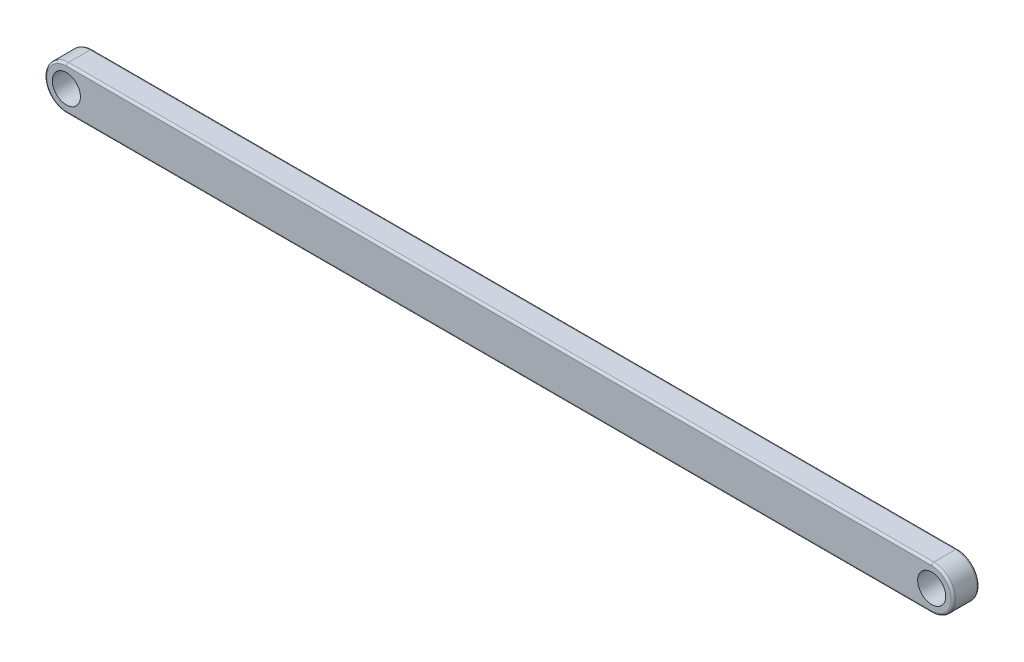
ISO-10303-21;
HEADER;
FILE_DESCRIPTION(('STEP AP214'),'2;1');
FILE_NAME('part.step','',(''),(''),'','','');
FILE_SCHEMA(('AUTOMOTIVE_DESIGN { 1 0 10303 214 1 1 1 1 }'));
ENDSEC;
DATA;
#1=APPLICATION_CONTEXT('core data for automotive mechanical design processes');
#2=APPLICATION_PROTOCOL_DEFINITION('international standard','automotive_design',2000,#1);
#3=PRODUCT_CONTEXT('',#1,'mechanical');
#4=PRODUCT('Part','Part','',(#3));
#5=PRODUCT_RELATED_PRODUCT_CATEGORY('part','',(#4));
#6=PRODUCT_DEFINITION_FORMATION('','',#4);
#7=PRODUCT_DEFINITION_CONTEXT('part definition',#1,'design');
#8=PRODUCT_DEFINITION('design','',#6,#7);
#9=PRODUCT_DEFINITION_SHAPE('','',#8);
#10=(LENGTH_UNIT() NAMED_UNIT(*) SI_UNIT(.MILLI.,.METRE.));
#11=(NAMED_UNIT(*) PLANE_ANGLE_UNIT() SI_UNIT($,.RADIAN.));
#12=(NAMED_UNIT(*) SI_UNIT($,.STERADIAN.) SOLID_ANGLE_UNIT());
#13=UNCERTAINTY_MEASURE_WITH_UNIT(LENGTH_MEASURE(1.E-05),#10,'distance_accuracy_value','');
#14=(GEOMETRIC_REPRESENTATION_CONTEXT(3) GLOBAL_UNCERTAINTY_ASSIGNED_CONTEXT((#13)) GLOBAL_UNIT_ASSIGNED_CONTEXT((#10,
#11,#12)) REPRESENTATION_CONTEXT('',''));
#15=CARTESIAN_POINT('',(0.,0.,0.));
#16=DIRECTION('',(0.,0.,1.));
#17=DIRECTION('',(1.,0.,0.));
#18=AXIS2_PLACEMENT_3D('',#15,#16,#17);
#19=CARTESIAN_POINT('',(-150.218340611354,0.,9.));
#20=DIRECTION('',(0.,0.,1.));
#21=DIRECTION('',(1.,0.,0.));
#22=AXIS2_PLACEMENT_3D('',#19,#20,#21);
#23=PLANE('',#22);
#24=DIRECTION('',(1.,0.,0.));
#25=VECTOR('',#24,1.);
#26=CARTESIAN_POINT('',(249.781659388646,-9.,9.));
#27=LINE('',#26,#25);
#28=CARTESIAN_POINT('',(-150.218340611354,-9.,9.));
#29=VERTEX_POINT('',#28);
#30=CARTESIAN_POINT('',(249.781659388646,-9.,9.));
#31=VERTEX_POINT('',#30);
#32=EDGE_CURVE('E52',#29,#31,#27,.T.);
#33=ORIENTED_EDGE('',*,*,#32,.T.);
#34=CARTESIAN_POINT('',(249.781659388646,0.,9.));
#35=DIRECTION('',(0.,0.,1.));
#36=DIRECTION('',(1.,0.,0.));
#37=AXIS2_PLACEMENT_3D('',#34,#35,#36);
#38=CIRCLE('',#37,9.);
#39=CARTESIAN_POINT('',(249.781659388646,9.,9.));
#40=VERTEX_POINT('',#39);
#41=EDGE_CURVE('E111',#31,#40,#38,.T.);
#42=ORIENTED_EDGE('',*,*,#41,.T.);
#43=DIRECTION('',(-1.,0.,0.));
#44=VECTOR('',#43,1.);
#45=CARTESIAN_POINT('',(-150.218340611354,9.,9.));
#46=LINE('',#45,#44);
#47=CARTESIAN_POINT('',(-150.218340611354,9.,9.));
#48=VERTEX_POINT('',#47);
#49=EDGE_CURVE('E135',#40,#48,#46,.T.);
#50=ORIENTED_EDGE('',*,*,#49,.T.);
#51=CARTESIAN_POINT('',(-150.218340611354,0.,9.));
#52=DIRECTION('',(0.,0.,1.));
#53=DIRECTION('',(1.,0.,0.));
#54=AXIS2_PLACEMENT_3D('',#51,#52,#53);
#55=CIRCLE('',#54,9.);
#56=EDGE_CURVE('E57',#48,#29,#55,.T.);
#57=ORIENTED_EDGE('',*,*,#56,.T.);
#58=EDGE_LOOP('',(#33,#42,#50,#57));
#59=FACE_BOUND('',#58,.T.);
#60=CARTESIAN_POINT('',(-150.218340611354,0.,9.));
#61=DIRECTION('',(0.,0.,1.));
#62=DIRECTION('',(1.,0.,0.));
#63=AXIS2_PLACEMENT_3D('',#60,#61,#62);
#64=CIRCLE('',#63,6.5);
#65=CARTESIAN_POINT('',(-143.718340611354,0.,9.));
#66=VERTEX_POINT('',#65);
#67=EDGE_CURVE('E172',#66,#66,#64,.T.);
#68=ORIENTED_EDGE('',*,*,#67,.F.);
#69=EDGE_LOOP('',(#68));
#70=FACE_BOUND('',#69,.T.);
#71=CARTESIAN_POINT('',(249.781659388646,0.,9.));
#72=DIRECTION('',(0.,0.,1.));
#73=DIRECTION('',(1.,0.,0.));
#74=AXIS2_PLACEMENT_3D('',#71,#72,#73);
#75=CIRCLE('',#74,6.50000000000002);
#76=CARTESIAN_POINT('',(256.281659388646,0.,9.));
#77=VERTEX_POINT('',#76);
#78=EDGE_CURVE('E164',#77,#77,#75,.T.);
#79=ORIENTED_EDGE('',*,*,#78,.F.);
#80=EDGE_LOOP('',(#79));
#81=FACE_BOUND('',#80,.T.);
#82=ADVANCED_FACE('F35',(#59,#70,#81),#23,.T.);
#83=CARTESIAN_POINT('',(-150.218340611354,0.,-3.));
#84=DIRECTION('',(0.,0.,1.));
#85=DIRECTION('',(1.,0.,0.));
#86=AXIS2_PLACEMENT_3D('',#83,#84,#85);
#87=PLANE('',#86);
#88=DIRECTION('',(-1.,0.,0.));
#89=VECTOR('',#88,1.);
#90=CARTESIAN_POINT('',(-150.218340611354,9.,-3.));
#91=LINE('',#90,#89);
#92=CARTESIAN_POINT('',(-150.218340611354,9.,-3.));
#93=VERTEX_POINT('',#92);
#94=CARTESIAN_POINT('',(249.781659388646,9.,-3.));
#95=VERTEX_POINT('',#94);
#96=EDGE_CURVE('E182',#93,#95,#91,.F.);
#97=ORIENTED_EDGE('',*,*,#96,.T.);
#98=CARTESIAN_POINT('',(249.781659388646,0.,-3.));
#99=DIRECTION('',(0.,0.,1.));
#100=DIRECTION('',(1.,0.,0.));
#101=AXIS2_PLACEMENT_3D('',#98,#99,#100);
#102=CIRCLE('',#101,9.);
#103=CARTESIAN_POINT('',(249.781659388646,-9.,-3.));
#104=VERTEX_POINT('',#103);
#105=EDGE_CURVE('E188',#95,#104,#102,.F.);
#106=ORIENTED_EDGE('',*,*,#105,.T.);
#107=DIRECTION('',(1.,0.,0.));
#108=VECTOR('',#107,1.);
#109=CARTESIAN_POINT('',(-150.218340611354,-9.,-3.));
#110=LINE('',#109,#108);
#111=CARTESIAN_POINT('',(-150.218340611354,-9.,-3.));
#112=VERTEX_POINT('',#111);
#113=EDGE_CURVE('E186',#104,#112,#110,.F.);
#114=ORIENTED_EDGE('',*,*,#113,.T.);
#115=CARTESIAN_POINT('',(-150.218340611354,0.,-3.));
#116=DIRECTION('',(0.,0.,1.));
#117=DIRECTION('',(1.,0.,0.));
#118=AXIS2_PLACEMENT_3D('',#115,#116,#117);
#119=CIRCLE('',#118,9.);
#120=EDGE_CURVE('E184',#112,#93,#119,.F.);
#121=ORIENTED_EDGE('',*,*,#120,.T.);
#122=EDGE_LOOP('',(#97,#106,#114,#121));
#123=FACE_BOUND('',#122,.T.);
#124=CARTESIAN_POINT('',(-150.218340611354,0.,-3.));
#125=DIRECTION('',(0.,0.,1.));
#126=DIRECTION('',(1.,0.,0.));
#127=AXIS2_PLACEMENT_3D('',#124,#125,#126);
#128=CIRCLE('',#127,6.5);
#129=CARTESIAN_POINT('',(-143.718340611354,0.,-3.));
#130=VERTEX_POINT('',#129);
#131=EDGE_CURVE('E169',#130,#130,#128,.T.);
#132=ORIENTED_EDGE('',*,*,#131,.T.);
#133=EDGE_LOOP('',(#132));
#134=FACE_BOUND('',#133,.T.);
#135=CARTESIAN_POINT('',(249.781659388646,0.,-3.));
#136=DIRECTION('',(0.,0.,1.));
#137=DIRECTION('',(1.,0.,0.));
#138=AXIS2_PLACEMENT_3D('',#135,#136,#137);
#139=CIRCLE('',#138,6.50000000000002);
#140=CARTESIAN_POINT('',(256.281659388646,0.,-3.));
#141=VERTEX_POINT('',#140);
#142=EDGE_CURVE('E158',#141,#141,#139,.T.);
#143=ORIENTED_EDGE('',*,*,#142,.T.);
#144=EDGE_LOOP('',(#143));
#145=FACE_BOUND('',#144,.T.);
#146=ADVANCED_FACE('F228',(#123,#134,#145),#87,.F.);
#147=CARTESIAN_POINT('',(-150.218340611354,0.,9.));
#148=DIRECTION('',(0.,0.,-1.));
#149=DIRECTION('',(-1.,0.,0.));
#150=AXIS2_PLACEMENT_3D('',#147,#148,#149);
#151=CYLINDRICAL_SURFACE('',#150,10.);
#152=DIRECTION('',(0.,0.,-1.));
#153=VECTOR('',#152,1.);
#154=CARTESIAN_POINT('',(-150.218340611354,10.,9.));
#155=LINE('',#154,#153);
#156=CARTESIAN_POINT('',(-150.218340611354,10.,8.));
#157=VERTEX_POINT('',#156);
#158=CARTESIAN_POINT('',(-150.218340611354,10.,-2.));
#159=VERTEX_POINT('',#158);
#160=EDGE_CURVE('E106',#157,#159,#155,.T.);
#161=ORIENTED_EDGE('',*,*,#160,.T.);
#162=CARTESIAN_POINT('',(-150.218340611354,0.,-2.));
#163=DIRECTION('',(0.,0.,1.));
#164=DIRECTION('',(1.,0.,0.));
#165=AXIS2_PLACEMENT_3D('',#162,#163,#164);
#166=CIRCLE('',#165,10.);
#167=CARTESIAN_POINT('',(-150.218340611354,-10.,-2.));
#168=VERTEX_POINT('',#167);
#169=EDGE_CURVE('E197',#159,#168,#166,.T.);
#170=ORIENTED_EDGE('',*,*,#169,.T.);
#171=DIRECTION('',(0.,0.,-1.));
#172=VECTOR('',#171,1.);
#173=CARTESIAN_POINT('',(-150.218340611354,-10.,9.));
#174=LINE('',#173,#172);
#175=CARTESIAN_POINT('',(-150.218340611354,-10.,8.));
#176=VERTEX_POINT('',#175);
#177=EDGE_CURVE('E132',#176,#168,#174,.T.);
#178=ORIENTED_EDGE('',*,*,#177,.F.);
#179=CARTESIAN_POINT('',(-150.218340611354,0.,8.));
#180=DIRECTION('',(0.,0.,1.));
#181=DIRECTION('',(1.,0.,0.));
#182=AXIS2_PLACEMENT_3D('',#179,#180,#181);
#183=CIRCLE('',#182,10.);
#184=EDGE_CURVE('E195',#176,#157,#183,.F.);
#185=ORIENTED_EDGE('',*,*,#184,.T.);
#186=EDGE_LOOP('',(#161,#170,#178,#185));
#187=FACE_BOUND('',#186,.T.);
#188=ADVANCED_FACE('F210',(#187),#151,.T.);
#189=CARTESIAN_POINT('',(-150.218340611354,-10.,9.));
#190=DIRECTION('',(0.,1.,0.));
#191=DIRECTION('',(0.,0.,1.));
#192=AXIS2_PLACEMENT_3D('',#189,#190,#191);
#193=PLANE('',#192);
#194=ORIENTED_EDGE('',*,*,#177,.T.);
#195=DIRECTION('',(1.,0.,0.));
#196=VECTOR('',#195,1.);
#197=CARTESIAN_POINT('',(-150.218340611354,-10.,-2.));
#198=LINE('',#197,#196);
#199=CARTESIAN_POINT('',(249.781659388646,-10.,-2.));
#200=VERTEX_POINT('',#199);
#201=EDGE_CURVE('E193',#168,#200,#198,.T.);
#202=ORIENTED_EDGE('',*,*,#201,.T.);
#203=DIRECTION('',(0.,0.,-1.));
#204=VECTOR('',#203,1.);
#205=CARTESIAN_POINT('',(249.781659388646,-10.,9.));
#206=LINE('',#205,#204);
#207=CARTESIAN_POINT('',(249.781659388646,-10.,8.));
#208=VERTEX_POINT('',#207);
#209=EDGE_CURVE('E123',#208,#200,#206,.T.);
#210=ORIENTED_EDGE('',*,*,#209,.F.);
#211=DIRECTION('',(1.,0.,0.));
#212=VECTOR('',#211,1.);
#213=CARTESIAN_POINT('',(-150.218340611354,-10.,8.));
#214=LINE('',#213,#212);
#215=EDGE_CURVE('E191',#208,#176,#214,.F.);
#216=ORIENTED_EDGE('',*,*,#215,.T.);
#217=EDGE_LOOP('',(#194,#202,#210,#216));
#218=FACE_BOUND('',#217,.T.);
#219=ADVANCED_FACE('F208',(#218),#193,.F.);
#220=CARTESIAN_POINT('',(249.781659388646,0.,9.));
#221=DIRECTION('',(0.,0.,-1.));
#222=DIRECTION('',(-1.,0.,0.));
#223=AXIS2_PLACEMENT_3D('',#220,#221,#222);
#224=CYLINDRICAL_SURFACE('',#223,10.);
#225=ORIENTED_EDGE('',*,*,#209,.T.);
#226=CARTESIAN_POINT('',(249.781659388646,0.,-2.));
#227=DIRECTION('',(0.,0.,1.));
#228=DIRECTION('',(1.,0.,0.));
#229=AXIS2_PLACEMENT_3D('',#226,#227,#228);
#230=CIRCLE('',#229,10.);
#231=CARTESIAN_POINT('',(249.781659388646,10.,-2.));
#232=VERTEX_POINT('',#231);
#233=EDGE_CURVE('E122',#200,#232,#230,.T.);
#234=ORIENTED_EDGE('',*,*,#233,.T.);
#235=DIRECTION('',(0.,0.,-1.));
#236=VECTOR('',#235,1.);
#237=CARTESIAN_POINT('',(249.781659388646,10.,9.));
#238=LINE('',#237,#236);
#239=CARTESIAN_POINT('',(249.781659388646,10.,8.));
#240=VERTEX_POINT('',#239);
#241=EDGE_CURVE('E104',#240,#232,#238,.T.);
#242=ORIENTED_EDGE('',*,*,#241,.F.);
#243=CARTESIAN_POINT('',(249.781659388646,0.,8.));
#244=DIRECTION('',(0.,0.,1.));
#245=DIRECTION('',(1.,0.,0.));
#246=AXIS2_PLACEMENT_3D('',#243,#244,#245);
#247=CIRCLE('',#246,10.);
#248=EDGE_CURVE('E119',#240,#208,#247,.F.);
#249=ORIENTED_EDGE('',*,*,#248,.T.);
#250=EDGE_LOOP('',(#225,#234,#242,#249));
#251=FACE_BOUND('',#250,.T.);
#252=ADVANCED_FACE('F118',(#251),#224,.T.);
#253=CARTESIAN_POINT('',(-150.218340611354,10.,9.));
#254=DIRECTION('',(0.,-1.,0.));
#255=DIRECTION('',(0.,0.,-1.));
#256=AXIS2_PLACEMENT_3D('',#253,#254,#255);
#257=PLANE('',#256);
#258=ORIENTED_EDGE('',*,*,#241,.T.);
#259=DIRECTION('',(-1.,0.,0.));
#260=VECTOR('',#259,1.);
#261=CARTESIAN_POINT('',(-150.218340611354,10.,-2.));
#262=LINE('',#261,#260);
#263=EDGE_CURVE('E11',#232,#159,#262,.T.);
#264=ORIENTED_EDGE('',*,*,#263,.T.);
#265=ORIENTED_EDGE('',*,*,#160,.F.);
#266=DIRECTION('',(-1.,0.,0.));
#267=VECTOR('',#266,1.);
#268=CARTESIAN_POINT('',(249.781659388646,10.,8.));
#269=LINE('',#268,#267);
#270=EDGE_CURVE('E44',#157,#240,#269,.F.);
#271=ORIENTED_EDGE('',*,*,#270,.T.);
#272=EDGE_LOOP('',(#258,#264,#265,#271));
#273=FACE_BOUND('',#272,.T.);
#274=ADVANCED_FACE('F103',(#273),#257,.F.);
#275=CARTESIAN_POINT('',(-150.218340611354,0.,9.));
#276=DIRECTION('',(0.,0.,-1.));
#277=DIRECTION('',(-1.,0.,0.));
#278=AXIS2_PLACEMENT_3D('',#275,#276,#277);
#279=CYLINDRICAL_SURFACE('',#278,6.5);
#280=ORIENTED_EDGE('',*,*,#67,.T.);
#281=EDGE_LOOP('',(#280));
#282=FACE_BOUND('',#281,.T.);
#283=ORIENTED_EDGE('',*,*,#131,.F.);
#284=EDGE_LOOP('',(#283));
#285=FACE_BOUND('',#284,.T.);
#286=ADVANCED_FACE('F236',(#282,#285),#279,.F.);
#287=CARTESIAN_POINT('',(249.781659388646,0.,9.));
#288=DIRECTION('',(0.,0.,-1.));
#289=DIRECTION('',(-1.,0.,0.));
#290=AXIS2_PLACEMENT_3D('',#287,#288,#289);
#291=CYLINDRICAL_SURFACE('',#290,6.50000000000002);
#292=ORIENTED_EDGE('',*,*,#78,.T.);
#293=EDGE_LOOP('',(#292));
#294=FACE_BOUND('',#293,.T.);
#295=ORIENTED_EDGE('',*,*,#142,.F.);
#296=EDGE_LOOP('',(#295));
#297=FACE_BOUND('',#296,.T.);
#298=ADVANCED_FACE('F267',(#294,#297),#291,.F.);
#299=CARTESIAN_POINT('',(-150.218340611354,0.,-2.));
#300=DIRECTION('',(0.,0.,1.));
#301=DIRECTION('',(1.,0.,0.));
#302=AXIS2_PLACEMENT_3D('',#299,#300,#301);
#303=TOROIDAL_SURFACE('',#302,9.,1.);
#304=CARTESIAN_POINT('',(-150.218340611354,9.,-2.));
#305=DIRECTION('',(1.,0.,0.));
#306=DIRECTION('',(0.,0.,-1.));
#307=AXIS2_PLACEMENT_3D('',#304,#305,#306);
#308=CIRCLE('',#307,1.);
#309=EDGE_CURVE('E151',#93,#159,#308,.T.);
#310=ORIENTED_EDGE('',*,*,#309,.F.);
#311=ORIENTED_EDGE('',*,*,#120,.F.);
#312=CARTESIAN_POINT('',(-150.218340611354,-9.,-2.));
#313=DIRECTION('',(1.,0.,0.));
#314=DIRECTION('',(0.,0.,-1.));
#315=AXIS2_PLACEMENT_3D('',#312,#313,#314);
#316=CIRCLE('',#315,1.);
#317=EDGE_CURVE('E140',#168,#112,#316,.T.);
#318=ORIENTED_EDGE('',*,*,#317,.F.);
#319=ORIENTED_EDGE('',*,*,#169,.F.);
#320=EDGE_LOOP('',(#310,#311,#318,#319));
#321=FACE_BOUND('',#320,.T.);
#322=ADVANCED_FACE('F213',(#321),#303,.T.);
#323=CARTESIAN_POINT('',(-150.218340611354,-9.,-2.));
#324=DIRECTION('',(1.,0.,0.));
#325=DIRECTION('',(0.,0.,-1.));
#326=AXIS2_PLACEMENT_3D('',#323,#324,#325);
#327=CYLINDRICAL_SURFACE('',#326,1.);
#328=ORIENTED_EDGE('',*,*,#317,.T.);
#329=ORIENTED_EDGE('',*,*,#113,.F.);
#330=CARTESIAN_POINT('',(249.781659388646,-9.,-2.));
#331=DIRECTION('',(1.,0.,0.));
#332=DIRECTION('',(0.,0.,-1.));
#333=AXIS2_PLACEMENT_3D('',#330,#331,#332);
#334=CIRCLE('',#333,1.);
#335=EDGE_CURVE('E145',#200,#104,#334,.T.);
#336=ORIENTED_EDGE('',*,*,#335,.F.);
#337=ORIENTED_EDGE('',*,*,#201,.F.);
#338=EDGE_LOOP('',(#328,#329,#336,#337));
#339=FACE_BOUND('',#338,.T.);
#340=ADVANCED_FACE('F216',(#339),#327,.T.);
#341=CARTESIAN_POINT('',(-150.218340611354,9.,-2.));
#342=DIRECTION('',(-1.,0.,0.));
#343=DIRECTION('',(0.,0.,1.));
#344=AXIS2_PLACEMENT_3D('',#341,#342,#343);
#345=CYLINDRICAL_SURFACE('',#344,1.);
#346=ORIENTED_EDGE('',*,*,#309,.T.);
#347=ORIENTED_EDGE('',*,*,#263,.F.);
#348=CARTESIAN_POINT('',(249.781659388646,9.,-2.));
#349=DIRECTION('',(1.,0.,0.));
#350=DIRECTION('',(0.,0.,-1.));
#351=AXIS2_PLACEMENT_3D('',#348,#349,#350);
#352=CIRCLE('',#351,1.);
#353=EDGE_CURVE('E143',#95,#232,#352,.T.);
#354=ORIENTED_EDGE('',*,*,#353,.F.);
#355=ORIENTED_EDGE('',*,*,#96,.F.);
#356=EDGE_LOOP('',(#346,#347,#354,#355));
#357=FACE_BOUND('',#356,.T.);
#358=ADVANCED_FACE('F219',(#357),#345,.T.);
#359=CARTESIAN_POINT('',(249.781659388646,0.,-2.));
#360=DIRECTION('',(0.,0.,1.));
#361=DIRECTION('',(1.,0.,0.));
#362=AXIS2_PLACEMENT_3D('',#359,#360,#361);
#363=TOROIDAL_SURFACE('',#362,9.,1.);
#364=ORIENTED_EDGE('',*,*,#335,.T.);
#365=ORIENTED_EDGE('',*,*,#105,.F.);
#366=ORIENTED_EDGE('',*,*,#353,.T.);
#367=ORIENTED_EDGE('',*,*,#233,.F.);
#368=EDGE_LOOP('',(#364,#365,#366,#367));
#369=FACE_BOUND('',#368,.T.);
#370=ADVANCED_FACE('F217',(#369),#363,.T.);
#371=CARTESIAN_POINT('',(-150.218340611354,0.,8.));
#372=DIRECTION('',(0.,0.,1.));
#373=DIRECTION('',(1.,0.,0.));
#374=AXIS2_PLACEMENT_3D('',#371,#372,#373);
#375=TOROIDAL_SURFACE('',#374,9.,1.);
#376=CARTESIAN_POINT('',(-150.218340611354,9.,8.));
#377=DIRECTION('',(1.,0.,0.));
#378=DIRECTION('',(0.,0.,-1.));
#379=AXIS2_PLACEMENT_3D('',#376,#377,#378);
#380=CIRCLE('',#379,1.);
#381=EDGE_CURVE('E137',#157,#48,#380,.T.);
#382=ORIENTED_EDGE('',*,*,#381,.F.);
#383=ORIENTED_EDGE('',*,*,#184,.F.);
#384=CARTESIAN_POINT('',(-150.218340611354,-9.,8.));
#385=DIRECTION('',(1.,0.,0.));
#386=DIRECTION('',(0.,0.,-1.));
#387=AXIS2_PLACEMENT_3D('',#384,#385,#386);
#388=CIRCLE('',#387,1.);
#389=EDGE_CURVE('E39',#29,#176,#388,.T.);
#390=ORIENTED_EDGE('',*,*,#389,.F.);
#391=ORIENTED_EDGE('',*,*,#56,.F.);
#392=EDGE_LOOP('',(#382,#383,#390,#391));
#393=FACE_BOUND('',#392,.T.);
#394=ADVANCED_FACE('F37',(#393),#375,.T.);
#395=CARTESIAN_POINT('',(-150.218340611354,-9.,8.));
#396=DIRECTION('',(-1.,0.,0.));
#397=DIRECTION('',(0.,0.,1.));
#398=AXIS2_PLACEMENT_3D('',#395,#396,#397);
#399=CYLINDRICAL_SURFACE('',#398,1.);
#400=ORIENTED_EDGE('',*,*,#389,.T.);
#401=ORIENTED_EDGE('',*,*,#215,.F.);
#402=CARTESIAN_POINT('',(249.781659388646,-9.,8.));
#403=DIRECTION('',(1.,0.,0.));
#404=DIRECTION('',(0.,0.,-1.));
#405=AXIS2_PLACEMENT_3D('',#402,#403,#404);
#406=CIRCLE('',#405,1.);
#407=EDGE_CURVE('E130',#31,#208,#406,.T.);
#408=ORIENTED_EDGE('',*,*,#407,.F.);
#409=ORIENTED_EDGE('',*,*,#32,.F.);
#410=EDGE_LOOP('',(#400,#401,#408,#409));
#411=FACE_BOUND('',#410,.T.);
#412=ADVANCED_FACE('F205',(#411),#399,.T.);
#413=CARTESIAN_POINT('',(-150.218340611354,9.,8.));
#414=DIRECTION('',(1.,0.,0.));
#415=DIRECTION('',(0.,0.,-1.));
#416=AXIS2_PLACEMENT_3D('',#413,#414,#415);
#417=CYLINDRICAL_SURFACE('',#416,1.);
#418=ORIENTED_EDGE('',*,*,#381,.T.);
#419=ORIENTED_EDGE('',*,*,#49,.F.);
#420=CARTESIAN_POINT('',(249.781659388646,9.,8.));
#421=DIRECTION('',(1.,0.,0.));
#422=DIRECTION('',(0.,0.,-1.));
#423=AXIS2_PLACEMENT_3D('',#420,#421,#422);
#424=CIRCLE('',#423,1.);
#425=EDGE_CURVE('E128',#240,#40,#424,.T.);
#426=ORIENTED_EDGE('',*,*,#425,.F.);
#427=ORIENTED_EDGE('',*,*,#270,.F.);
#428=EDGE_LOOP('',(#418,#419,#426,#427));
#429=FACE_BOUND('',#428,.T.);
#430=ADVANCED_FACE('F134',(#429),#417,.T.);
#431=CARTESIAN_POINT('',(249.781659388646,0.,8.));
#432=DIRECTION('',(0.,0.,1.));
#433=DIRECTION('',(1.,0.,0.));
#434=AXIS2_PLACEMENT_3D('',#431,#432,#433);
#435=TOROIDAL_SURFACE('',#434,9.,1.);
#436=ORIENTED_EDGE('',*,*,#407,.T.);
#437=ORIENTED_EDGE('',*,*,#248,.F.);
#438=ORIENTED_EDGE('',*,*,#425,.T.);
#439=ORIENTED_EDGE('',*,*,#41,.F.);
#440=EDGE_LOOP('',(#436,#437,#438,#439));
#441=FACE_BOUND('',#440,.T.);
#442=ADVANCED_FACE('F126',(#441),#435,.T.);
#443=CLOSED_SHELL('',(#82,#146,#188,#219,#252,#274,#286,#298,#322,#340,#358,#370,#394,#412,#430,#442));
#444=MANIFOLD_SOLID_BREP('B2',#443);
#445=ADVANCED_BREP_SHAPE_REPRESENTATION('',(#18,#444),#14);
#446=SHAPE_DEFINITION_REPRESENTATION(#9,#445);
ENDSEC;
END-ISO-10303-21;
